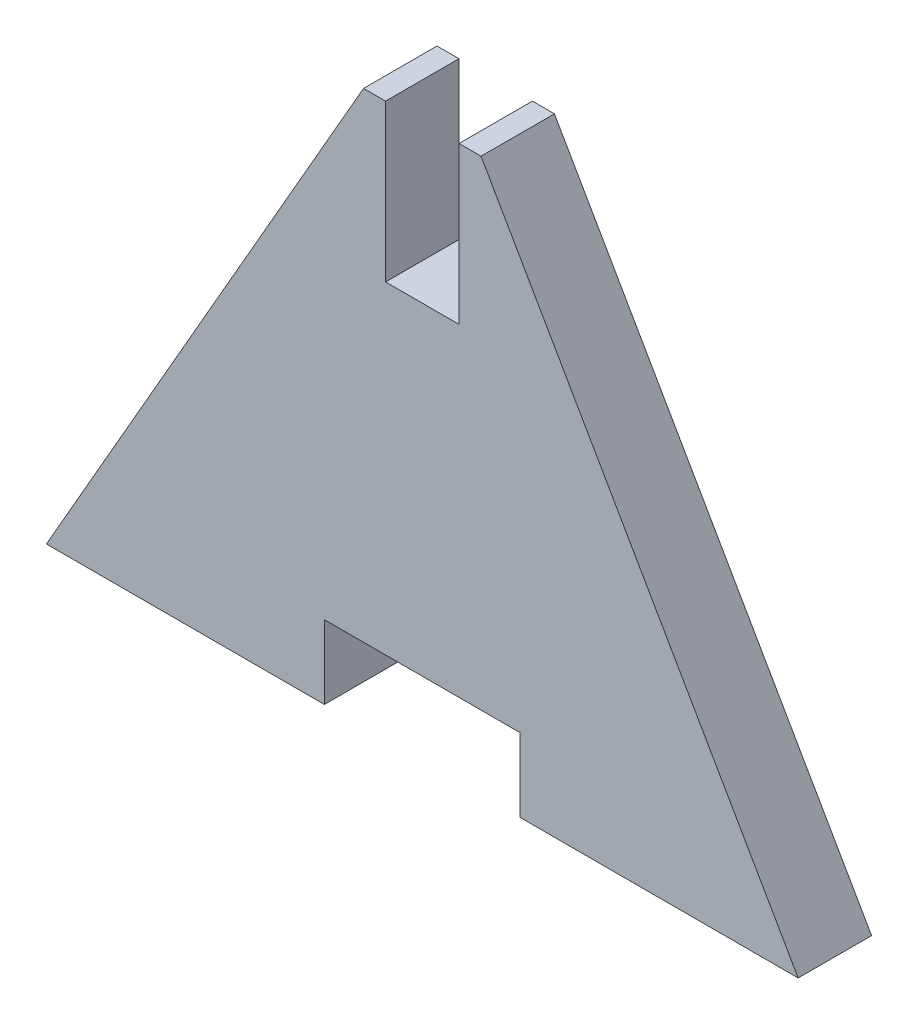
ISO-10303-21;
HEADER;
FILE_DESCRIPTION(('STEP AP214'),'2;1');
FILE_NAME('part.step','',(''),(''),'','','');
FILE_SCHEMA(('AUTOMOTIVE_DESIGN { 1 0 10303 214 1 1 1 1 }'));
ENDSEC;
DATA;
#1=APPLICATION_CONTEXT('core data for automotive mechanical design processes');
#2=APPLICATION_PROTOCOL_DEFINITION('international standard','automotive_design',2000,#1);
#3=PRODUCT_CONTEXT('',#1,'mechanical');
#4=PRODUCT('Part','Part','',(#3));
#5=PRODUCT_RELATED_PRODUCT_CATEGORY('part','',(#4));
#6=PRODUCT_DEFINITION_FORMATION('','',#4);
#7=PRODUCT_DEFINITION_CONTEXT('part definition',#1,'design');
#8=PRODUCT_DEFINITION('design','',#6,#7);
#9=PRODUCT_DEFINITION_SHAPE('','',#8);
#10=(LENGTH_UNIT() NAMED_UNIT(*) SI_UNIT(.MILLI.,.METRE.));
#11=(NAMED_UNIT(*) PLANE_ANGLE_UNIT() SI_UNIT($,.RADIAN.));
#12=(NAMED_UNIT(*) SI_UNIT($,.STERADIAN.) SOLID_ANGLE_UNIT());
#13=UNCERTAINTY_MEASURE_WITH_UNIT(LENGTH_MEASURE(1.E-05),#10,'distance_accuracy_value','');
#14=(GEOMETRIC_REPRESENTATION_CONTEXT(3) GLOBAL_UNCERTAINTY_ASSIGNED_CONTEXT((#13)) GLOBAL_UNIT_ASSIGNED_CONTEXT((#10,
#11,#12)) REPRESENTATION_CONTEXT('',''));
#15=CARTESIAN_POINT('',(0.,0.,0.));
#16=DIRECTION('',(0.,0.,1.));
#17=DIRECTION('',(1.,0.,0.));
#18=AXIS2_PLACEMENT_3D('',#15,#16,#17);
#19=CARTESIAN_POINT('',(-3.81,35.8824667400063,0.));
#20=DIRECTION('',(0.,-1.,0.));
#21=DIRECTION('',(1.,0.,0.));
#22=AXIS2_PLACEMENT_3D('',#19,#20,#21);
#23=PLANE('',#22);
#24=DIRECTION('',(1.,0.,0.));
#25=VECTOR('',#24,1.);
#26=CARTESIAN_POINT('',(-3.81,35.8824667400063,0.));
#27=LINE('',#26,#25);
#28=CARTESIAN_POINT('',(2.38125000000003,35.8824667400063,0.));
#29=VERTEX_POINT('',#28);
#30=CARTESIAN_POINT('',(3.81,35.8824667400063,0.));
#31=VERTEX_POINT('',#30);
#32=EDGE_CURVE('E215',#29,#31,#27,.T.);
#33=ORIENTED_EDGE('',*,*,#32,.F.);
#34=DIRECTION('',(0.,0.,-1.));
#35=VECTOR('',#34,1.);
#36=CARTESIAN_POINT('',(2.38125000000003,35.8824667400063,0.));
#37=LINE('',#36,#35);
#38=CARTESIAN_POINT('',(2.38125000000003,35.8824667400063,4.7625));
#39=VERTEX_POINT('',#38);
#40=EDGE_CURVE('E134',#39,#29,#37,.T.);
#41=ORIENTED_EDGE('',*,*,#40,.F.);
#42=DIRECTION('',(1.,0.,0.));
#43=VECTOR('',#42,1.);
#44=CARTESIAN_POINT('',(-3.81,35.8824667400063,4.7625));
#45=LINE('',#44,#43);
#46=CARTESIAN_POINT('',(3.81,35.8824667400063,4.7625));
#47=VERTEX_POINT('',#46);
#48=EDGE_CURVE('E168',#39,#47,#45,.T.);
#49=ORIENTED_EDGE('',*,*,#48,.T.);
#50=DIRECTION('',(0.,0.,1.));
#51=VECTOR('',#50,1.);
#52=CARTESIAN_POINT('',(3.81,35.8824667400063,0.));
#53=LINE('',#52,#51);
#54=EDGE_CURVE('E192',#31,#47,#53,.T.);
#55=ORIENTED_EDGE('',*,*,#54,.F.);
#56=EDGE_LOOP('',(#33,#41,#49,#55));
#57=FACE_BOUND('',#56,.T.);
#58=ADVANCED_FACE('F39',(#57),#23,.F.);
#59=CARTESIAN_POINT('',(24.384,0.,4.7625));
#60=DIRECTION('',(0.,1.,0.));
#61=DIRECTION('',(0.,0.,1.));
#62=AXIS2_PLACEMENT_3D('',#59,#60,#61);
#63=PLANE('',#62);
#64=DIRECTION('',(1.,0.,0.));
#65=VECTOR('',#64,1.);
#66=CARTESIAN_POINT('',(24.384,0.,0.));
#67=LINE('',#66,#65);
#68=CARTESIAN_POINT('',(-24.384,0.,0.));
#69=VERTEX_POINT('',#68);
#70=CARTESIAN_POINT('',(-6.35,0.,0.));
#71=VERTEX_POINT('',#70);
#72=EDGE_CURVE('E241',#69,#71,#67,.T.);
#73=ORIENTED_EDGE('',*,*,#72,.T.);
#74=DIRECTION('',(0.,0.,1.));
#75=VECTOR('',#74,1.);
#76=CARTESIAN_POINT('',(-6.35,0.,0.));
#77=LINE('',#76,#75);
#78=CARTESIAN_POINT('',(-6.35,0.,4.7625));
#79=VERTEX_POINT('',#78);
#80=EDGE_CURVE('E198',#71,#79,#77,.T.);
#81=ORIENTED_EDGE('',*,*,#80,.T.);
#82=DIRECTION('',(1.,0.,0.));
#83=VECTOR('',#82,1.);
#84=CARTESIAN_POINT('',(24.384,0.,4.7625));
#85=LINE('',#84,#83);
#86=CARTESIAN_POINT('',(-24.384,0.,4.7625));
#87=VERTEX_POINT('',#86);
#88=EDGE_CURVE('E230',#87,#79,#85,.T.);
#89=ORIENTED_EDGE('',*,*,#88,.F.);
#90=DIRECTION('',(0.,0.,-1.));
#91=VECTOR('',#90,1.);
#92=CARTESIAN_POINT('',(-24.384,0.,4.7625));
#93=LINE('',#92,#91);
#94=EDGE_CURVE('E11',#87,#69,#93,.T.);
#95=ORIENTED_EDGE('',*,*,#94,.T.);
#96=EDGE_LOOP('',(#73,#81,#89,#95));
#97=FACE_BOUND('',#96,.T.);
#98=ADVANCED_FACE('F277',(#97),#63,.F.);
#99=CARTESIAN_POINT('',(0.,42.5273679881556,4.7625));
#100=DIRECTION('',(0.867515972178932,-0.497409326424871,0.));
#101=DIRECTION('',(0.497409326424871,0.867515972178932,0.));
#102=AXIS2_PLACEMENT_3D('',#99,#100,#101);
#103=PLANE('',#102);
#104=DIRECTION('',(-0.49740932642487,-0.867515972178931,0.));
#105=VECTOR('',#104,1.);
#106=CARTESIAN_POINT('',(0.,42.5273679881556,4.7625));
#107=LINE('',#106,#105);
#108=CARTESIAN_POINT('',(-3.81,35.8824667400063,4.7625));
#109=VERTEX_POINT('',#108);
#110=EDGE_CURVE('E225',#109,#87,#107,.T.);
#111=ORIENTED_EDGE('',*,*,#110,.F.);
#112=DIRECTION('',(0.,0.,1.));
#113=VECTOR('',#112,1.);
#114=CARTESIAN_POINT('',(-3.81,35.8824667400063,0.));
#115=LINE('',#114,#113);
#116=CARTESIAN_POINT('',(-3.81,35.8824667400063,0.));
#117=VERTEX_POINT('',#116);
#118=EDGE_CURVE('E214',#117,#109,#115,.T.);
#119=ORIENTED_EDGE('',*,*,#118,.F.);
#120=DIRECTION('',(-0.49740932642487,-0.867515972178931,0.));
#121=VECTOR('',#120,1.);
#122=CARTESIAN_POINT('',(0.,42.5273679881556,0.));
#123=LINE('',#122,#121);
#124=EDGE_CURVE('E202',#117,#69,#123,.T.);
#125=ORIENTED_EDGE('',*,*,#124,.T.);
#126=ORIENTED_EDGE('',*,*,#94,.F.);
#127=EDGE_LOOP('',(#111,#119,#125,#126));
#128=FACE_BOUND('',#127,.T.);
#129=ADVANCED_FACE('F41',(#128),#103,.F.);
#130=CARTESIAN_POINT('',(6.35,0.,4.7625));
#131=VERTEX_POINT('',#130);
#132=CARTESIAN_POINT('',(24.384,0.,4.7625));
#133=VERTEX_POINT('',#132);
#134=EDGE_CURVE('E228',#131,#133,#85,.T.);
#135=ORIENTED_EDGE('',*,*,#134,.F.);
#136=DIRECTION('',(0.,0.,1.));
#137=VECTOR('',#136,1.);
#138=CARTESIAN_POINT('',(6.35,0.,0.));
#139=LINE('',#138,#137);
#140=CARTESIAN_POINT('',(6.35,0.,0.));
#141=VERTEX_POINT('',#140);
#142=EDGE_CURVE('E186',#141,#131,#139,.T.);
#143=ORIENTED_EDGE('',*,*,#142,.F.);
#144=CARTESIAN_POINT('',(24.384,0.,0.));
#145=VERTEX_POINT('',#144);
#146=EDGE_CURVE('E240',#141,#145,#67,.T.);
#147=ORIENTED_EDGE('',*,*,#146,.T.);
#148=DIRECTION('',(0.,0.,-1.));
#149=VECTOR('',#148,1.);
#150=CARTESIAN_POINT('',(24.384,0.,4.7625));
#151=LINE('',#150,#149);
#152=EDGE_CURVE('E48',#133,#145,#151,.T.);
#153=ORIENTED_EDGE('',*,*,#152,.F.);
#154=EDGE_LOOP('',(#135,#143,#147,#153));
#155=FACE_BOUND('',#154,.T.);
#156=ADVANCED_FACE('F269',(#155),#63,.F.);
#157=CARTESIAN_POINT('',(0.,42.5273679881556,4.7625));
#158=DIRECTION('',(-0.867515972178932,-0.497409326424871,0.));
#159=DIRECTION('',(0.497409326424871,-0.867515972178932,0.));
#160=AXIS2_PLACEMENT_3D('',#157,#158,#159);
#161=PLANE('',#160);
#162=DIRECTION('',(-0.49740932642487,0.867515972178931,0.));
#163=VECTOR('',#162,1.);
#164=CARTESIAN_POINT('',(0.,42.5273679881556,0.));
#165=LINE('',#164,#163);
#166=EDGE_CURVE('E229',#145,#31,#165,.T.);
#167=ORIENTED_EDGE('',*,*,#166,.T.);
#168=ORIENTED_EDGE('',*,*,#54,.T.);
#169=DIRECTION('',(-0.49740932642487,0.867515972178931,0.));
#170=VECTOR('',#169,1.);
#171=CARTESIAN_POINT('',(0.,42.5273679881556,4.7625));
#172=LINE('',#171,#170);
#173=EDGE_CURVE('E234',#133,#47,#172,.T.);
#174=ORIENTED_EDGE('',*,*,#173,.F.);
#175=ORIENTED_EDGE('',*,*,#152,.T.);
#176=EDGE_LOOP('',(#167,#168,#174,#175));
#177=FACE_BOUND('',#176,.T.);
#178=ADVANCED_FACE('F253',(#177),#161,.F.);
#179=CARTESIAN_POINT('',(0.,0.,4.7625));
#180=DIRECTION('',(0.,0.,-1.));
#181=DIRECTION('',(-1.,0.,0.));
#182=AXIS2_PLACEMENT_3D('',#179,#180,#181);
#183=PLANE('',#182);
#184=ORIENTED_EDGE('',*,*,#48,.F.);
#185=DIRECTION('',(0.,1.,0.));
#186=VECTOR('',#185,1.);
#187=CARTESIAN_POINT('',(2.38125000000002,25.7224667400063,4.7625));
#188=LINE('',#187,#186);
#189=CARTESIAN_POINT('',(2.38125000000002,25.7224667400063,4.7625));
#190=VERTEX_POINT('',#189);
#191=EDGE_CURVE('E165',#190,#39,#188,.T.);
#192=ORIENTED_EDGE('',*,*,#191,.F.);
#193=DIRECTION('',(1.,0.,0.));
#194=VECTOR('',#193,1.);
#195=CARTESIAN_POINT('',(-2.38124999999998,25.7224667400063,4.7625));
#196=LINE('',#195,#194);
#197=CARTESIAN_POINT('',(-2.38124999999998,25.7224667400063,4.7625));
#198=VERTEX_POINT('',#197);
#199=EDGE_CURVE('E139',#198,#190,#196,.T.);
#200=ORIENTED_EDGE('',*,*,#199,.F.);
#201=DIRECTION('',(0.,1.,0.));
#202=VECTOR('',#201,1.);
#203=CARTESIAN_POINT('',(-2.38124999999998,25.7224667400063,4.7625));
#204=LINE('',#203,#202);
#205=CARTESIAN_POINT('',(-2.38124999999997,35.8824667400063,4.7625));
#206=VERTEX_POINT('',#205);
#207=EDGE_CURVE('E169',#198,#206,#204,.T.);
#208=ORIENTED_EDGE('',*,*,#207,.T.);
#209=EDGE_CURVE('E216',#109,#206,#45,.T.);
#210=ORIENTED_EDGE('',*,*,#209,.F.);
#211=ORIENTED_EDGE('',*,*,#110,.T.);
#212=ORIENTED_EDGE('',*,*,#88,.T.);
#213=DIRECTION('',(0.,-1.,0.));
#214=VECTOR('',#213,1.);
#215=CARTESIAN_POINT('',(-6.35,0.,4.7625));
#216=LINE('',#215,#214);
#217=CARTESIAN_POINT('',(-6.35,4.7625,4.7625));
#218=VERTEX_POINT('',#217);
#219=EDGE_CURVE('E179',#218,#79,#216,.T.);
#220=ORIENTED_EDGE('',*,*,#219,.F.);
#221=DIRECTION('',(-1.,0.,0.));
#222=VECTOR('',#221,1.);
#223=CARTESIAN_POINT('',(-6.35,4.7625,4.7625));
#224=LINE('',#223,#222);
#225=CARTESIAN_POINT('',(6.35,4.7625,4.7625));
#226=VERTEX_POINT('',#225);
#227=EDGE_CURVE('E191',#226,#218,#224,.T.);
#228=ORIENTED_EDGE('',*,*,#227,.F.);
#229=DIRECTION('',(0.,1.,0.));
#230=VECTOR('',#229,1.);
#231=CARTESIAN_POINT('',(6.35,4.7625,4.7625));
#232=LINE('',#231,#230);
#233=EDGE_CURVE('E187',#131,#226,#232,.T.);
#234=ORIENTED_EDGE('',*,*,#233,.F.);
#235=ORIENTED_EDGE('',*,*,#134,.T.);
#236=ORIENTED_EDGE('',*,*,#173,.T.);
#237=EDGE_LOOP('',(#184,#192,#200,#208,#210,#211,#212,#220,#228,#234,#235,#236));
#238=FACE_BOUND('',#237,.T.);
#239=ADVANCED_FACE('F262',(#238),#183,.F.);
#240=CARTESIAN_POINT('',(0.,0.,0.));
#241=DIRECTION('',(0.,0.,-1.));
#242=DIRECTION('',(-1.,0.,0.));
#243=AXIS2_PLACEMENT_3D('',#240,#241,#242);
#244=PLANE('',#243);
#245=DIRECTION('',(0.,1.,0.));
#246=VECTOR('',#245,1.);
#247=CARTESIAN_POINT('',(2.38125000000002,25.7224667400063,0.));
#248=LINE('',#247,#246);
#249=CARTESIAN_POINT('',(2.38125000000002,25.7224667400063,0.));
#250=VERTEX_POINT('',#249);
#251=EDGE_CURVE('E128',#250,#29,#248,.T.);
#252=ORIENTED_EDGE('',*,*,#251,.T.);
#253=ORIENTED_EDGE('',*,*,#32,.T.);
#254=ORIENTED_EDGE('',*,*,#166,.F.);
#255=ORIENTED_EDGE('',*,*,#146,.F.);
#256=DIRECTION('',(0.,1.,0.));
#257=VECTOR('',#256,1.);
#258=CARTESIAN_POINT('',(6.35,4.7625,0.));
#259=LINE('',#258,#257);
#260=CARTESIAN_POINT('',(6.35,4.7625,0.));
#261=VERTEX_POINT('',#260);
#262=EDGE_CURVE('E175',#141,#261,#259,.T.);
#263=ORIENTED_EDGE('',*,*,#262,.T.);
#264=DIRECTION('',(-1.,0.,0.));
#265=VECTOR('',#264,1.);
#266=CARTESIAN_POINT('',(-6.35,4.7625,0.));
#267=LINE('',#266,#265);
#268=CARTESIAN_POINT('',(-6.35,4.7625,0.));
#269=VERTEX_POINT('',#268);
#270=EDGE_CURVE('E63',#261,#269,#267,.T.);
#271=ORIENTED_EDGE('',*,*,#270,.T.);
#272=DIRECTION('',(0.,-1.,0.));
#273=VECTOR('',#272,1.);
#274=CARTESIAN_POINT('',(-6.35,0.,0.));
#275=LINE('',#274,#273);
#276=EDGE_CURVE('E182',#269,#71,#275,.T.);
#277=ORIENTED_EDGE('',*,*,#276,.T.);
#278=ORIENTED_EDGE('',*,*,#72,.F.);
#279=ORIENTED_EDGE('',*,*,#124,.F.);
#280=CARTESIAN_POINT('',(-2.38124999999998,35.8824667400063,0.));
#281=VERTEX_POINT('',#280);
#282=EDGE_CURVE('E211',#117,#281,#27,.T.);
#283=ORIENTED_EDGE('',*,*,#282,.T.);
#284=DIRECTION('',(0.,1.,0.));
#285=VECTOR('',#284,1.);
#286=CARTESIAN_POINT('',(-2.38124999999998,25.7224667400063,0.));
#287=LINE('',#286,#285);
#288=CARTESIAN_POINT('',(-2.38124999999998,25.7224667400063,0.));
#289=VERTEX_POINT('',#288);
#290=EDGE_CURVE('E55',#289,#281,#287,.T.);
#291=ORIENTED_EDGE('',*,*,#290,.F.);
#292=DIRECTION('',(-1.,0.,0.));
#293=VECTOR('',#292,1.);
#294=CARTESIAN_POINT('',(-2.38124999999998,25.7224667400063,0.));
#295=LINE('',#294,#293);
#296=EDGE_CURVE('E145',#250,#289,#295,.T.);
#297=ORIENTED_EDGE('',*,*,#296,.F.);
#298=EDGE_LOOP('',(#252,#253,#254,#255,#263,#271,#277,#278,#279,#283,#291,#297));
#299=FACE_BOUND('',#298,.T.);
#300=ADVANCED_FACE('F151',(#299),#244,.T.);
#301=ORIENTED_EDGE('',*,*,#209,.T.);
#302=DIRECTION('',(0.,0.,1.));
#303=VECTOR('',#302,1.);
#304=CARTESIAN_POINT('',(-2.38124999999997,35.8824667400063,0.));
#305=LINE('',#304,#303);
#306=EDGE_CURVE('E149',#281,#206,#305,.T.);
#307=ORIENTED_EDGE('',*,*,#306,.F.);
#308=ORIENTED_EDGE('',*,*,#282,.F.);
#309=ORIENTED_EDGE('',*,*,#118,.T.);
#310=EDGE_LOOP('',(#301,#307,#308,#309));
#311=FACE_BOUND('',#310,.T.);
#312=ADVANCED_FACE('F284',(#311),#23,.F.);
#313=CARTESIAN_POINT('',(-6.35,0.,0.));
#314=DIRECTION('',(-1.,0.,0.));
#315=DIRECTION('',(0.,0.,1.));
#316=AXIS2_PLACEMENT_3D('',#313,#314,#315);
#317=PLANE('',#316);
#318=ORIENTED_EDGE('',*,*,#219,.T.);
#319=ORIENTED_EDGE('',*,*,#80,.F.);
#320=ORIENTED_EDGE('',*,*,#276,.F.);
#321=DIRECTION('',(0.,0.,1.));
#322=VECTOR('',#321,1.);
#323=CARTESIAN_POINT('',(-6.35,4.7625,0.));
#324=LINE('',#323,#322);
#325=EDGE_CURVE('E203',#269,#218,#324,.T.);
#326=ORIENTED_EDGE('',*,*,#325,.T.);
#327=EDGE_LOOP('',(#318,#319,#320,#326));
#328=FACE_BOUND('',#327,.T.);
#329=ADVANCED_FACE('F288',(#328),#317,.F.);
#330=CARTESIAN_POINT('',(-6.35,4.7625,0.));
#331=DIRECTION('',(0.,1.,0.));
#332=DIRECTION('',(0.,0.,1.));
#333=AXIS2_PLACEMENT_3D('',#330,#331,#332);
#334=PLANE('',#333);
#335=ORIENTED_EDGE('',*,*,#227,.T.);
#336=ORIENTED_EDGE('',*,*,#325,.F.);
#337=ORIENTED_EDGE('',*,*,#270,.F.);
#338=DIRECTION('',(0.,0.,1.));
#339=VECTOR('',#338,1.);
#340=CARTESIAN_POINT('',(6.35,4.7625,0.));
#341=LINE('',#340,#339);
#342=EDGE_CURVE('E206',#261,#226,#341,.T.);
#343=ORIENTED_EDGE('',*,*,#342,.T.);
#344=EDGE_LOOP('',(#335,#336,#337,#343));
#345=FACE_BOUND('',#344,.T.);
#346=ADVANCED_FACE('F289',(#345),#334,.F.);
#347=CARTESIAN_POINT('',(6.35,4.7625,0.));
#348=DIRECTION('',(1.,0.,0.));
#349=DIRECTION('',(0.,1.,0.));
#350=AXIS2_PLACEMENT_3D('',#347,#348,#349);
#351=PLANE('',#350);
#352=ORIENTED_EDGE('',*,*,#233,.T.);
#353=ORIENTED_EDGE('',*,*,#342,.F.);
#354=ORIENTED_EDGE('',*,*,#262,.F.);
#355=ORIENTED_EDGE('',*,*,#142,.T.);
#356=EDGE_LOOP('',(#352,#353,#354,#355));
#357=FACE_BOUND('',#356,.T.);
#358=ADVANCED_FACE('F271',(#357),#351,.F.);
#359=CARTESIAN_POINT('',(2.38125000000002,25.7224667400063,0.));
#360=DIRECTION('',(1.,0.,0.));
#361=DIRECTION('',(0.,1.,0.));
#362=AXIS2_PLACEMENT_3D('',#359,#360,#361);
#363=PLANE('',#362);
#364=ORIENTED_EDGE('',*,*,#40,.T.);
#365=ORIENTED_EDGE('',*,*,#251,.F.);
#366=DIRECTION('',(0.,0.,-1.));
#367=VECTOR('',#366,1.);
#368=CARTESIAN_POINT('',(2.38125000000002,25.7224667400063,0.));
#369=LINE('',#368,#367);
#370=EDGE_CURVE('E131',#190,#250,#369,.T.);
#371=ORIENTED_EDGE('',*,*,#370,.F.);
#372=ORIENTED_EDGE('',*,*,#191,.T.);
#373=EDGE_LOOP('',(#364,#365,#371,#372));
#374=FACE_BOUND('',#373,.T.);
#375=ADVANCED_FACE('F130',(#374),#363,.F.);
#376=CARTESIAN_POINT('',(-2.38124999999998,25.7224667400063,0.));
#377=DIRECTION('',(-1.,0.,0.));
#378=DIRECTION('',(0.,-1.,0.));
#379=AXIS2_PLACEMENT_3D('',#376,#377,#378);
#380=PLANE('',#379);
#381=ORIENTED_EDGE('',*,*,#306,.T.);
#382=ORIENTED_EDGE('',*,*,#207,.F.);
#383=DIRECTION('',(0.,0.,1.));
#384=VECTOR('',#383,1.);
#385=CARTESIAN_POINT('',(-2.38124999999998,25.7224667400063,0.));
#386=LINE('',#385,#384);
#387=EDGE_CURVE('E154',#289,#198,#386,.T.);
#388=ORIENTED_EDGE('',*,*,#387,.F.);
#389=ORIENTED_EDGE('',*,*,#290,.T.);
#390=EDGE_LOOP('',(#381,#382,#388,#389));
#391=FACE_BOUND('',#390,.T.);
#392=ADVANCED_FACE('F286',(#391),#380,.F.);
#393=CARTESIAN_POINT('',(0.,25.7224667400063,0.));
#394=DIRECTION('',(0.,1.,0.));
#395=DIRECTION('',(0.,0.,1.));
#396=AXIS2_PLACEMENT_3D('',#393,#394,#395);
#397=PLANE('',#396);
#398=ORIENTED_EDGE('',*,*,#370,.T.);
#399=ORIENTED_EDGE('',*,*,#296,.T.);
#400=ORIENTED_EDGE('',*,*,#387,.T.);
#401=ORIENTED_EDGE('',*,*,#199,.T.);
#402=EDGE_LOOP('',(#398,#399,#400,#401));
#403=FACE_BOUND('',#402,.T.);
#404=ADVANCED_FACE('F143',(#403),#397,.T.);
#405=CLOSED_SHELL('',(#58,#98,#129,#156,#178,#239,#300,#312,#329,#346,#358,#375,#392,#404));
#406=MANIFOLD_SOLID_BREP('B2',#405);
#407=ADVANCED_BREP_SHAPE_REPRESENTATION('',(#18,#406),#14);
#408=SHAPE_DEFINITION_REPRESENTATION(#9,#407);
ENDSEC;
END-ISO-10303-21;
